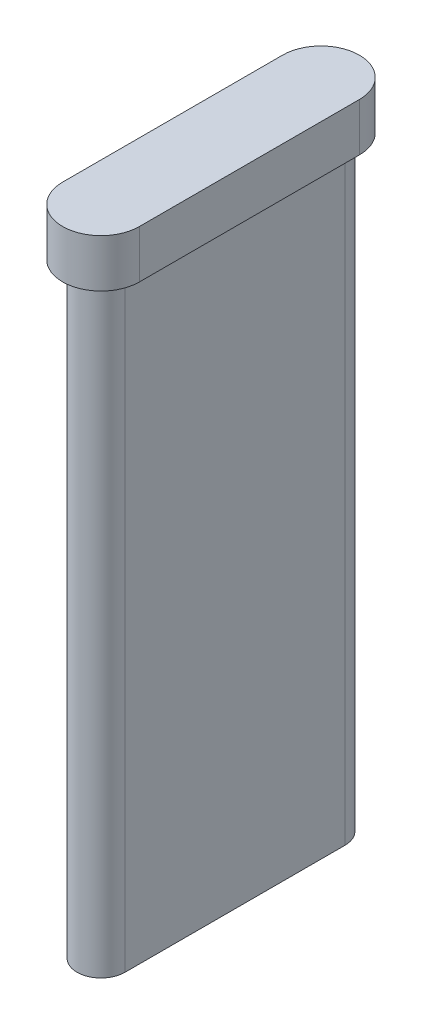
ISO-10303-21;
HEADER;
FILE_DESCRIPTION(('STEP AP214'),'2;1');
FILE_NAME('part.step','',(''),(''),'','','');
FILE_SCHEMA(('AUTOMOTIVE_DESIGN { 1 0 10303 214 1 1 1 1 }'));
ENDSEC;
DATA;
#1=APPLICATION_CONTEXT('core data for automotive mechanical design processes');
#2=APPLICATION_PROTOCOL_DEFINITION('international standard','automotive_design',2000,#1);
#3=PRODUCT_CONTEXT('',#1,'mechanical');
#4=PRODUCT('Part','Part','',(#3));
#5=PRODUCT_RELATED_PRODUCT_CATEGORY('part','',(#4));
#6=PRODUCT_DEFINITION_FORMATION('','',#4);
#7=PRODUCT_DEFINITION_CONTEXT('part definition',#1,'design');
#8=PRODUCT_DEFINITION('design','',#6,#7);
#9=PRODUCT_DEFINITION_SHAPE('','',#8);
#10=(LENGTH_UNIT() NAMED_UNIT(*) SI_UNIT(.MILLI.,.METRE.));
#11=(NAMED_UNIT(*) PLANE_ANGLE_UNIT() SI_UNIT($,.RADIAN.));
#12=(NAMED_UNIT(*) SI_UNIT($,.STERADIAN.) SOLID_ANGLE_UNIT());
#13=UNCERTAINTY_MEASURE_WITH_UNIT(LENGTH_MEASURE(1.E-05),#10,'distance_accuracy_value','');
#14=(GEOMETRIC_REPRESENTATION_CONTEXT(3) GLOBAL_UNCERTAINTY_ASSIGNED_CONTEXT((#13)) GLOBAL_UNIT_ASSIGNED_CONTEXT((#10,
#11,#12)) REPRESENTATION_CONTEXT('',''));
#15=CARTESIAN_POINT('',(0.,0.,0.));
#16=DIRECTION('',(0.,0.,1.));
#17=DIRECTION('',(1.,0.,0.));
#18=AXIS2_PLACEMENT_3D('',#15,#16,#17);
#19=CARTESIAN_POINT('',(0.,-68.,11.45));
#20=DIRECTION('',(0.,1.,0.));
#21=DIRECTION('',(0.,0.,1.));
#22=AXIS2_PLACEMENT_3D('',#19,#20,#21);
#23=CYLINDRICAL_SURFACE('',#22,2.5);
#24=DIRECTION('',(0.,1.,0.));
#25=VECTOR('',#24,1.);
#26=CARTESIAN_POINT('',(2.5,-68.,11.45));
#27=LINE('',#26,#25);
#28=CARTESIAN_POINT('',(2.5,-68.,11.45));
#29=VERTEX_POINT('',#28);
#30=CARTESIAN_POINT('',(2.5,-5.,11.45));
#31=VERTEX_POINT('',#30);
#32=EDGE_CURVE('E162',#29,#31,#27,.T.);
#33=ORIENTED_EDGE('',*,*,#32,.T.);
#34=CARTESIAN_POINT('',(0.,-5.,11.45));
#35=DIRECTION('',(0.,1.,0.));
#36=DIRECTION('',(0.,0.,1.));
#37=AXIS2_PLACEMENT_3D('',#34,#35,#36);
#38=CIRCLE('',#37,2.5);
#39=CARTESIAN_POINT('',(-2.5,-5.,11.45));
#40=VERTEX_POINT('',#39);
#41=EDGE_CURVE('E53',#31,#40,#38,.F.);
#42=ORIENTED_EDGE('',*,*,#41,.T.);
#43=DIRECTION('',(0.,1.,0.));
#44=VECTOR('',#43,1.);
#45=CARTESIAN_POINT('',(-2.5,-68.,11.45));
#46=LINE('',#45,#44);
#47=CARTESIAN_POINT('',(-2.5,-68.,11.45));
#48=VERTEX_POINT('',#47);
#49=EDGE_CURVE('E46',#48,#40,#46,.T.);
#50=ORIENTED_EDGE('',*,*,#49,.F.);
#51=CARTESIAN_POINT('',(0.,-68.,11.45));
#52=DIRECTION('',(0.,1.,0.));
#53=DIRECTION('',(0.,0.,1.));
#54=AXIS2_PLACEMENT_3D('',#51,#52,#53);
#55=CIRCLE('',#54,2.5);
#56=EDGE_CURVE('E151',#48,#29,#55,.T.);
#57=ORIENTED_EDGE('',*,*,#56,.T.);
#58=EDGE_LOOP('',(#33,#42,#50,#57));
#59=FACE_BOUND('',#58,.T.);
#60=ADVANCED_FACE('F39',(#59),#23,.T.);
#61=CARTESIAN_POINT('',(-2.5,-68.,11.45));
#62=DIRECTION('',(-1.,0.,0.));
#63=DIRECTION('',(0.,0.,1.));
#64=AXIS2_PLACEMENT_3D('',#61,#62,#63);
#65=PLANE('',#64);
#66=ORIENTED_EDGE('',*,*,#49,.T.);
#67=DIRECTION('',(0.,0.,-1.));
#68=VECTOR('',#67,1.);
#69=CARTESIAN_POINT('',(-2.5,-5.,11.45));
#70=LINE('',#69,#68);
#71=CARTESIAN_POINT('',(-2.50000000000001,-5.,-11.45));
#72=VERTEX_POINT('',#71);
#73=EDGE_CURVE('E147',#40,#72,#70,.T.);
#74=ORIENTED_EDGE('',*,*,#73,.T.);
#75=DIRECTION('',(0.,1.,0.));
#76=VECTOR('',#75,1.);
#77=CARTESIAN_POINT('',(-2.50000000000001,-68.,-11.45));
#78=LINE('',#77,#76);
#79=CARTESIAN_POINT('',(-2.50000000000001,-68.,-11.45));
#80=VERTEX_POINT('',#79);
#81=EDGE_CURVE('E164',#80,#72,#78,.T.);
#82=ORIENTED_EDGE('',*,*,#81,.F.);
#83=DIRECTION('',(0.,0.,1.));
#84=VECTOR('',#83,1.);
#85=CARTESIAN_POINT('',(-2.5,-68.,11.45));
#86=LINE('',#85,#84);
#87=EDGE_CURVE('E159',#80,#48,#86,.T.);
#88=ORIENTED_EDGE('',*,*,#87,.T.);
#89=EDGE_LOOP('',(#66,#74,#82,#88));
#90=FACE_BOUND('',#89,.T.);
#91=ADVANCED_FACE('F180',(#90),#65,.T.);
#92=CARTESIAN_POINT('',(0.,-68.,-11.45));
#93=DIRECTION('',(0.,1.,0.));
#94=DIRECTION('',(0.,0.,1.));
#95=AXIS2_PLACEMENT_3D('',#92,#93,#94);
#96=CYLINDRICAL_SURFACE('',#95,2.5);
#97=ORIENTED_EDGE('',*,*,#81,.T.);
#98=CARTESIAN_POINT('',(0.,-5.,-11.45));
#99=DIRECTION('',(0.,1.,0.));
#100=DIRECTION('',(0.,0.,1.));
#101=AXIS2_PLACEMENT_3D('',#98,#99,#100);
#102=CIRCLE('',#101,2.5);
#103=CARTESIAN_POINT('',(2.5,-5.,-11.45));
#104=VERTEX_POINT('',#103);
#105=EDGE_CURVE('E141',#72,#104,#102,.F.);
#106=ORIENTED_EDGE('',*,*,#105,.T.);
#107=DIRECTION('',(0.,1.,0.));
#108=VECTOR('',#107,1.);
#109=CARTESIAN_POINT('',(2.5,-68.,-11.45));
#110=LINE('',#109,#108);
#111=CARTESIAN_POINT('',(2.5,-68.,-11.45));
#112=VERTEX_POINT('',#111);
#113=EDGE_CURVE('E167',#112,#104,#110,.T.);
#114=ORIENTED_EDGE('',*,*,#113,.F.);
#115=CARTESIAN_POINT('',(0.,-68.,-11.45));
#116=DIRECTION('',(0.,1.,0.));
#117=DIRECTION('',(0.,0.,1.));
#118=AXIS2_PLACEMENT_3D('',#115,#116,#117);
#119=CIRCLE('',#118,2.5);
#120=EDGE_CURVE('E156',#112,#80,#119,.T.);
#121=ORIENTED_EDGE('',*,*,#120,.T.);
#122=EDGE_LOOP('',(#97,#106,#114,#121));
#123=FACE_BOUND('',#122,.T.);
#124=ADVANCED_FACE('F178',(#123),#96,.T.);
#125=CARTESIAN_POINT('',(2.5,-68.,11.45));
#126=DIRECTION('',(1.,0.,0.));
#127=DIRECTION('',(0.,0.,-1.));
#128=AXIS2_PLACEMENT_3D('',#125,#126,#127);
#129=PLANE('',#128);
#130=ORIENTED_EDGE('',*,*,#113,.T.);
#131=DIRECTION('',(0.,0.,1.));
#132=VECTOR('',#131,1.);
#133=CARTESIAN_POINT('',(2.5,-5.,11.45));
#134=LINE('',#133,#132);
#135=EDGE_CURVE('E11',#104,#31,#134,.T.);
#136=ORIENTED_EDGE('',*,*,#135,.T.);
#137=ORIENTED_EDGE('',*,*,#32,.F.);
#138=DIRECTION('',(0.,0.,-1.));
#139=VECTOR('',#138,1.);
#140=CARTESIAN_POINT('',(2.5,-68.,11.45));
#141=LINE('',#140,#139);
#142=EDGE_CURVE('E153',#29,#112,#141,.T.);
#143=ORIENTED_EDGE('',*,*,#142,.T.);
#144=EDGE_LOOP('',(#130,#136,#137,#143));
#145=FACE_BOUND('',#144,.T.);
#146=ADVANCED_FACE('F172',(#145),#129,.T.);
#147=CARTESIAN_POINT('',(0.,-68.,11.45));
#148=DIRECTION('',(0.,1.,0.));
#149=DIRECTION('',(0.,0.,1.));
#150=AXIS2_PLACEMENT_3D('',#147,#148,#149);
#151=PLANE('',#150);
#152=ORIENTED_EDGE('',*,*,#56,.F.);
#153=ORIENTED_EDGE('',*,*,#87,.F.);
#154=ORIENTED_EDGE('',*,*,#120,.F.);
#155=ORIENTED_EDGE('',*,*,#142,.F.);
#156=EDGE_LOOP('',(#152,#153,#154,#155));
#157=FACE_BOUND('',#156,.T.);
#158=ADVANCED_FACE('F175',(#157),#151,.F.);
#159=CARTESIAN_POINT('',(0.,-5.,11.45));
#160=DIRECTION('',(0.,1.,0.));
#161=DIRECTION('',(0.,0.,1.));
#162=AXIS2_PLACEMENT_3D('',#159,#160,#161);
#163=CYLINDRICAL_SURFACE('',#162,4.);
#164=CARTESIAN_POINT('',(0.,0.,11.45));
#165=DIRECTION('',(0.,1.,0.));
#166=DIRECTION('',(0.,0.,1.));
#167=AXIS2_PLACEMENT_3D('',#164,#165,#166);
#168=CIRCLE('',#167,4.);
#169=CARTESIAN_POINT('',(-4.,0.,11.45));
#170=VERTEX_POINT('',#169);
#171=CARTESIAN_POINT('',(4.,0.,11.45));
#172=VERTEX_POINT('',#171);
#173=EDGE_CURVE('E135',#170,#172,#168,.T.);
#174=ORIENTED_EDGE('',*,*,#173,.F.);
#175=DIRECTION('',(0.,1.,0.));
#176=VECTOR('',#175,1.);
#177=CARTESIAN_POINT('',(-4.,-5.,11.45));
#178=LINE('',#177,#176);
#179=CARTESIAN_POINT('',(-4.,-5.,11.45));
#180=VERTEX_POINT('',#179);
#181=EDGE_CURVE('E126',#180,#170,#178,.T.);
#182=ORIENTED_EDGE('',*,*,#181,.F.);
#183=CARTESIAN_POINT('',(0.,-5.,11.45));
#184=DIRECTION('',(0.,1.,0.));
#185=DIRECTION('',(0.,0.,1.));
#186=AXIS2_PLACEMENT_3D('',#183,#184,#185);
#187=CIRCLE('',#186,4.);
#188=CARTESIAN_POINT('',(4.,-5.,11.45));
#189=VERTEX_POINT('',#188);
#190=EDGE_CURVE('E120',#180,#189,#187,.T.);
#191=ORIENTED_EDGE('',*,*,#190,.T.);
#192=DIRECTION('',(0.,1.,0.));
#193=VECTOR('',#192,1.);
#194=CARTESIAN_POINT('',(4.,-5.,11.45));
#195=LINE('',#194,#193);
#196=EDGE_CURVE('E102',#189,#172,#195,.T.);
#197=ORIENTED_EDGE('',*,*,#196,.T.);
#198=EDGE_LOOP('',(#174,#182,#191,#197));
#199=FACE_BOUND('',#198,.T.);
#200=ADVANCED_FACE('F125',(#199),#163,.T.);
#201=CARTESIAN_POINT('',(-4.00000000000001,-5.,-11.45));
#202=DIRECTION('',(-1.,0.,0.));
#203=DIRECTION('',(0.,0.,1.));
#204=AXIS2_PLACEMENT_3D('',#201,#202,#203);
#205=PLANE('',#204);
#206=DIRECTION('',(0.,0.,1.));
#207=VECTOR('',#206,1.);
#208=CARTESIAN_POINT('',(-4.00000000000001,0.,-11.45));
#209=LINE('',#208,#207);
#210=CARTESIAN_POINT('',(-4.00000000000001,0.,-11.45));
#211=VERTEX_POINT('',#210);
#212=EDGE_CURVE('E127',#211,#170,#209,.T.);
#213=ORIENTED_EDGE('',*,*,#212,.F.);
#214=DIRECTION('',(0.,1.,0.));
#215=VECTOR('',#214,1.);
#216=CARTESIAN_POINT('',(-4.00000000000001,-5.,-11.45));
#217=LINE('',#216,#215);
#218=CARTESIAN_POINT('',(-4.00000000000001,-5.,-11.45));
#219=VERTEX_POINT('',#218);
#220=EDGE_CURVE('E142',#219,#211,#217,.T.);
#221=ORIENTED_EDGE('',*,*,#220,.F.);
#222=DIRECTION('',(0.,0.,1.));
#223=VECTOR('',#222,1.);
#224=CARTESIAN_POINT('',(-4.00000000000001,-5.,-11.45));
#225=LINE('',#224,#223);
#226=EDGE_CURVE('E113',#219,#180,#225,.T.);
#227=ORIENTED_EDGE('',*,*,#226,.T.);
#228=ORIENTED_EDGE('',*,*,#181,.T.);
#229=EDGE_LOOP('',(#213,#221,#227,#228));
#230=FACE_BOUND('',#229,.T.);
#231=ADVANCED_FACE('F198',(#230),#205,.T.);
#232=CARTESIAN_POINT('',(0.,-5.,-11.45));
#233=DIRECTION('',(0.,1.,0.));
#234=DIRECTION('',(0.,0.,1.));
#235=AXIS2_PLACEMENT_3D('',#232,#233,#234);
#236=CYLINDRICAL_SURFACE('',#235,4.);
#237=CARTESIAN_POINT('',(0.,0.,-11.45));
#238=DIRECTION('',(0.,1.,0.));
#239=DIRECTION('',(0.,0.,1.));
#240=AXIS2_PLACEMENT_3D('',#237,#238,#239);
#241=CIRCLE('',#240,4.);
#242=CARTESIAN_POINT('',(4.,0.,-11.45));
#243=VERTEX_POINT('',#242);
#244=EDGE_CURVE('E130',#243,#211,#241,.T.);
#245=ORIENTED_EDGE('',*,*,#244,.F.);
#246=DIRECTION('',(0.,1.,0.));
#247=VECTOR('',#246,1.);
#248=CARTESIAN_POINT('',(4.,-5.,-11.45));
#249=LINE('',#248,#247);
#250=CARTESIAN_POINT('',(4.,-5.,-11.45));
#251=VERTEX_POINT('',#250);
#252=EDGE_CURVE('E112',#251,#243,#249,.T.);
#253=ORIENTED_EDGE('',*,*,#252,.F.);
#254=CARTESIAN_POINT('',(0.,-5.,-11.45));
#255=DIRECTION('',(0.,1.,0.));
#256=DIRECTION('',(0.,0.,1.));
#257=AXIS2_PLACEMENT_3D('',#254,#255,#256);
#258=CIRCLE('',#257,4.);
#259=EDGE_CURVE('E123',#251,#219,#258,.T.);
#260=ORIENTED_EDGE('',*,*,#259,.T.);
#261=ORIENTED_EDGE('',*,*,#220,.T.);
#262=EDGE_LOOP('',(#245,#253,#260,#261));
#263=FACE_BOUND('',#262,.T.);
#264=ADVANCED_FACE('F203',(#263),#236,.T.);
#265=CARTESIAN_POINT('',(4.,-5.,11.45));
#266=DIRECTION('',(1.,0.,0.));
#267=DIRECTION('',(0.,0.,-1.));
#268=AXIS2_PLACEMENT_3D('',#265,#266,#267);
#269=PLANE('',#268);
#270=DIRECTION('',(0.,0.,-1.));
#271=VECTOR('',#270,1.);
#272=CARTESIAN_POINT('',(4.,0.,11.45));
#273=LINE('',#272,#271);
#274=EDGE_CURVE('E107',#172,#243,#273,.T.);
#275=ORIENTED_EDGE('',*,*,#274,.F.);
#276=ORIENTED_EDGE('',*,*,#196,.F.);
#277=DIRECTION('',(0.,0.,-1.));
#278=VECTOR('',#277,1.);
#279=CARTESIAN_POINT('',(4.,-5.,11.45));
#280=LINE('',#279,#278);
#281=EDGE_CURVE('E105',#189,#251,#280,.T.);
#282=ORIENTED_EDGE('',*,*,#281,.T.);
#283=ORIENTED_EDGE('',*,*,#252,.T.);
#284=EDGE_LOOP('',(#275,#276,#282,#283));
#285=FACE_BOUND('',#284,.T.);
#286=ADVANCED_FACE('F104',(#285),#269,.T.);
#287=CARTESIAN_POINT('',(0.,-5.,11.45));
#288=DIRECTION('',(0.,1.,0.));
#289=DIRECTION('',(0.,0.,1.));
#290=AXIS2_PLACEMENT_3D('',#287,#288,#289);
#291=PLANE('',#290);
#292=ORIENTED_EDGE('',*,*,#41,.F.);
#293=ORIENTED_EDGE('',*,*,#135,.F.);
#294=ORIENTED_EDGE('',*,*,#105,.F.);
#295=ORIENTED_EDGE('',*,*,#73,.F.);
#296=EDGE_LOOP('',(#292,#293,#294,#295));
#297=FACE_BOUND('',#296,.T.);
#298=ORIENTED_EDGE('',*,*,#190,.F.);
#299=ORIENTED_EDGE('',*,*,#226,.F.);
#300=ORIENTED_EDGE('',*,*,#259,.F.);
#301=ORIENTED_EDGE('',*,*,#281,.F.);
#302=EDGE_LOOP('',(#298,#299,#300,#301));
#303=FACE_BOUND('',#302,.T.);
#304=ADVANCED_FACE('F118',(#297,#303),#291,.F.);
#305=CARTESIAN_POINT('',(0.,0.,11.45));
#306=DIRECTION('',(0.,1.,0.));
#307=DIRECTION('',(0.,0.,1.));
#308=AXIS2_PLACEMENT_3D('',#305,#306,#307);
#309=PLANE('',#308);
#310=ORIENTED_EDGE('',*,*,#173,.T.);
#311=ORIENTED_EDGE('',*,*,#274,.T.);
#312=ORIENTED_EDGE('',*,*,#244,.T.);
#313=ORIENTED_EDGE('',*,*,#212,.T.);
#314=EDGE_LOOP('',(#310,#311,#312,#313));
#315=FACE_BOUND('',#314,.T.);
#316=ADVANCED_FACE('F189',(#315),#309,.T.);
#317=CLOSED_SHELL('',(#60,#91,#124,#146,#158,#200,#231,#264,#286,#304,#316));
#318=MANIFOLD_SOLID_BREP('B2',#317);
#319=ADVANCED_BREP_SHAPE_REPRESENTATION('',(#18,#318),#14);
#320=SHAPE_DEFINITION_REPRESENTATION(#9,#319);
ENDSEC;
END-ISO-10303-21;
